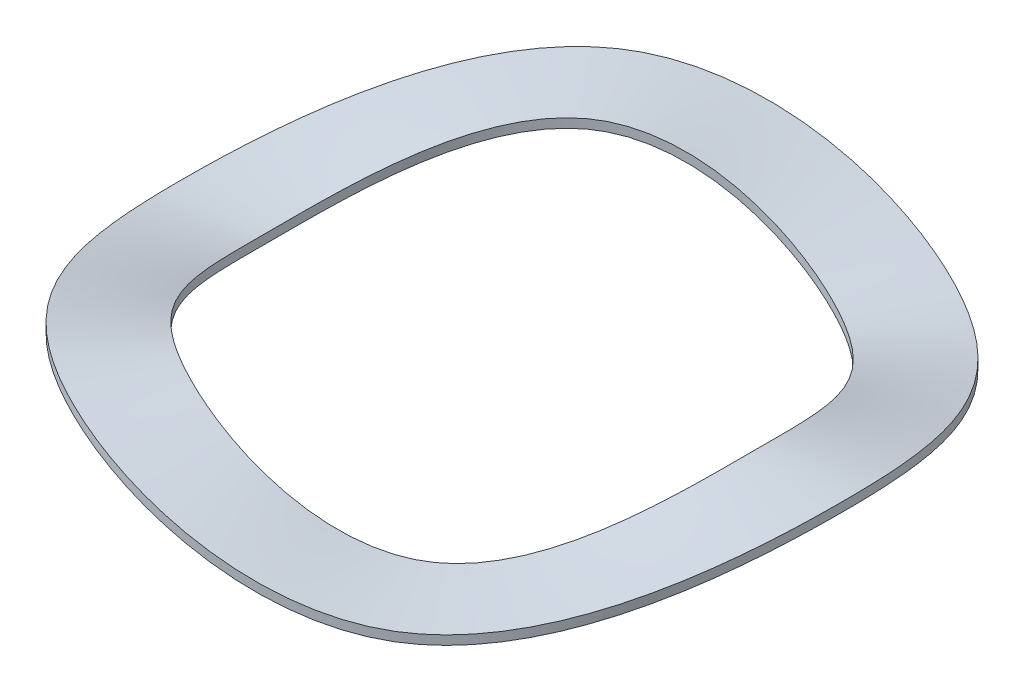
ISO-10303-21;
HEADER;
FILE_DESCRIPTION(('STEP AP214'),'2;1');
FILE_NAME('part.step','',(''),(''),'','','');
FILE_SCHEMA(('AUTOMOTIVE_DESIGN { 1 0 10303 214 1 1 1 1 }'));
ENDSEC;
DATA;
#1=APPLICATION_CONTEXT('core data for automotive mechanical design processes');
#2=APPLICATION_PROTOCOL_DEFINITION('international standard','automotive_design',2000,#1);
#3=PRODUCT_CONTEXT('',#1,'mechanical');
#4=PRODUCT('Part','Part','',(#3));
#5=PRODUCT_RELATED_PRODUCT_CATEGORY('part','',(#4));
#6=PRODUCT_DEFINITION_FORMATION('','',#4);
#7=PRODUCT_DEFINITION_CONTEXT('part definition',#1,'design');
#8=PRODUCT_DEFINITION('design','',#6,#7);
#9=PRODUCT_DEFINITION_SHAPE('','',#8);
#10=(LENGTH_UNIT() NAMED_UNIT(*) SI_UNIT(.MILLI.,.METRE.));
#11=(NAMED_UNIT(*) PLANE_ANGLE_UNIT() SI_UNIT($,.RADIAN.));
#12=(NAMED_UNIT(*) SI_UNIT($,.STERADIAN.) SOLID_ANGLE_UNIT());
#13=UNCERTAINTY_MEASURE_WITH_UNIT(LENGTH_MEASURE(1.E-05),#10,'distance_accuracy_value','');
#14=(GEOMETRIC_REPRESENTATION_CONTEXT(3) GLOBAL_UNCERTAINTY_ASSIGNED_CONTEXT((#13)) GLOBAL_UNIT_ASSIGNED_CONTEXT((#10,
#11,#12)) REPRESENTATION_CONTEXT('',''));
#15=CARTESIAN_POINT('',(0.,0.,0.));
#16=DIRECTION('',(0.,0.,1.));
#17=DIRECTION('',(1.,0.,0.));
#18=AXIS2_PLACEMENT_3D('',#15,#16,#17);
#19=CARTESIAN_POINT('',(-5.5499,0.1524,0.));
#20=CARTESIAN_POINT('',(-5.54989999999635,0.152400000000402,-0.096127087767811));
#21=CARTESIAN_POINT('',(-5.54435009998969,0.156718000001133,-0.28838126330368));
#22=CARTESIAN_POINT('',(-5.51979179248156,0.174853600002023,-0.576041573449913));
#23=CARTESIAN_POINT('',(-5.47941626997514,0.20335240000272,-0.862259977280256));
#24=CARTESIAN_POINT('',(-5.1447572999461,0.428752000005845,-2.5665932434171));
#25=CARTESIAN_POINT('',(-2.88594800003815,1.70687999999541,-5.76762526616717));
#26=CARTESIAN_POINT('',(3.3299400000528,-0.711199999995901,-5.76762526615841));
#27=CARTESIAN_POINT('',(6.6598799999156,1.87960000002413,1.21759732559044E-10));
#28=CARTESIAN_POINT('',(3.3299400004387,-0.711199999980904,5.76762526596535));
#29=CARTESIAN_POINT('',(-2.88594800037881,1.70687999998361,5.76762526596342));
#30=CARTESIAN_POINT('',(-5.14475730012056,0.428751999996578,2.56659324346797));
#31=CARTESIAN_POINT('',(-5.47941627004028,0.203352399995618,0.862259977274331));
#32=CARTESIAN_POINT('',(-5.51979179252526,0.174853599997228,0.576041573447317));
#33=CARTESIAN_POINT('',(-5.54435010001163,0.156717999998718,0.288381263303185));
#34=CARTESIAN_POINT('',(-5.54990000000366,0.152399999999597,0.0961270877678108));
#35=CARTESIAN_POINT('',(-5.5499,0.1524,0.));
#36=CARTESIAN_POINT('',(-5.0546,0.1524,0.));
#37=CARTESIAN_POINT('',(-5.05459999999667,0.152400000000403,-0.087548240118052));
#38=CARTESIAN_POINT('',(-5.04954539999061,0.156718000001134,-0.262644720354381));
#39=CARTESIAN_POINT('',(-5.02717879498321,0.174853600002023,-0.524632828908616));
#40=CARTESIAN_POINT('',(-4.99040657997736,0.20335240000272,-0.785307713861652));
#41=CARTESIAN_POINT('',(-4.68561419995091,0.428752000005846,-2.33753801116706));
#42=CARTESIAN_POINT('',(-2.62839200003474,1.70687999999541,-5.25289440717285));
#43=CARTESIAN_POINT('',(3.03276000004809,-0.711199999995901,-5.25289440716487));
#44=CARTESIAN_POINT('',(6.06551999992313,1.87960000002413,1.10892841946857E-10));
#45=CARTESIAN_POINT('',(3.03276000039955,-0.711199999980904,5.25289440698904));
#46=CARTESIAN_POINT('',(-2.62839200034501,1.70687999998361,5.25289440698728));
#47=CARTESIAN_POINT('',(-4.6856142001098,0.428751999996578,2.33753801121339));
#48=CARTESIAN_POINT('',(-4.99040658003668,0.203352399995618,0.785307713856256));
#49=CARTESIAN_POINT('',(-5.02717879502301,0.174853599997228,0.524632828906252));
#50=CARTESIAN_POINT('',(-5.04954540001059,0.156717999998718,0.262644720353931));
#51=CARTESIAN_POINT('',(-5.05460000000333,0.152399999999597,0.087548240118052));
#52=CARTESIAN_POINT('',(-5.0546,0.1524,0.));
#53=CARTESIAN_POINT('',(-4.5593,0.1524,0.));
#54=CARTESIAN_POINT('',(-4.559299999997,0.152400000000403,-0.078969392468293));
#55=CARTESIAN_POINT('',(-4.55474069999153,0.156718000001134,-0.236908177405082));
#56=CARTESIAN_POINT('',(-4.53456579748485,0.174853600002023,-0.473224084367319));
#57=CARTESIAN_POINT('',(-4.50139688997958,0.20335240000272,-0.708355450443048));
#58=CARTESIAN_POINT('',(-4.22647109995572,0.428752000005846,-2.10848277891702));
#59=CARTESIAN_POINT('',(-2.37083600003134,1.70687999999541,-4.73816354817852));
#60=CARTESIAN_POINT('',(2.73558000004338,-0.711199999995901,-4.73816354817133));
#61=CARTESIAN_POINT('',(5.47115999993066,1.87960000002413,1.00026635737292E-10));
#62=CARTESIAN_POINT('',(2.7355800003604,-0.711199999980904,4.73816354801273));
#63=CARTESIAN_POINT('',(-2.3708360003112,1.70687999998361,4.73816354801114));
#64=CARTESIAN_POINT('',(-4.22647110009904,0.428751999996578,2.10848277895881));
#65=CARTESIAN_POINT('',(-4.50139689003309,0.203352399995618,0.708355450438181));
#66=CARTESIAN_POINT('',(-4.53456579752075,0.174853599997228,0.473224084365187));
#67=CARTESIAN_POINT('',(-4.55474070000955,0.156717999998718,0.236908177404676));
#68=CARTESIAN_POINT('',(-4.559300000003,0.152399999999597,0.0789693924682933));
#69=CARTESIAN_POINT('',(-4.5593,0.1524,0.));
#70=CARTESIAN_POINT('',(-4.064,0.1524,0.));
#71=CARTESIAN_POINT('',(-4.06399999999732,0.152400000000403,-0.0703905448185346));
#72=CARTESIAN_POINT('',(-4.05993599999245,0.156718000001134,-0.211171634455784));
#73=CARTESIAN_POINT('',(-4.0419527999865,0.174853600002023,-0.421815339826023));
#74=CARTESIAN_POINT('',(-4.0123871999818,0.20335240000272,-0.631403187024444));
#75=CARTESIAN_POINT('',(-3.76732799996053,0.428752000005846,-1.87942754666698));
#76=CARTESIAN_POINT('',(-2.11328000002793,1.70687999999541,-4.2234326891842));
#77=CARTESIAN_POINT('',(2.43840000003866,-0.711199999995901,-4.22343268917778));
#78=CARTESIAN_POINT('',(4.8767999999382,1.87960000002413,8.91604464683862E-11));
#79=CARTESIAN_POINT('',(2.43840000032124,-0.711199999980904,4.22343268903641));
#80=CARTESIAN_POINT('',(-2.11328000027739,1.70687999998361,4.223432689035));
#81=CARTESIAN_POINT('',(-3.76732800008828,0.428751999996578,1.87942754670423));
#82=CARTESIAN_POINT('',(-4.01238720002949,0.203352399995618,0.631403187020105));
#83=CARTESIAN_POINT('',(-4.0419528000185,0.174853599997228,0.421815339824122));
#84=CARTESIAN_POINT('',(-4.05993600000851,0.156717999998718,0.211171634455421));
#85=CARTESIAN_POINT('',(-4.06400000000268,0.152399999999597,0.0703905448185339));
#86=CARTESIAN_POINT('',(-4.064,0.1524,0.));
#87=B_SPLINE_SURFACE_WITH_KNOTS('',3,3,((#19,#20,#21,#22,#23,#24,#25,#26,#27,#28,#29,#30,#31,
#32,#33,#34,#35),(#36,#37,#38,#39,#40,#41,#42,#43,#44,#45,#46,#47,#48,#49,#50,#51,#52),(#53,#54,
#55,#56,#57,#58,#59,#60,#61,#62,#63,#64,#65,#66,#67,#68,#69),(#70,#71,#72,#73,#74,#75,#76,#77,
#78,#79,#80,#81,#82,#83,#84,#85,#86)),.UNSPECIFIED.,.F.,.T.,.F.,(4,4),(4,1,1,1,1,1,1,1,1,1,1,1,
1,1,4),(0.,1.),(0.,0.0083333333333333,0.0166666666666666,0.0250000000000001,0.0333333333333334,
0.166666666666668,0.33333333333335,0.500000000000564,0.666666666674567,0.833333333325995,
0.966666666666667,0.975,0.983333333333333,0.991666666666667,1.),.UNSPECIFIED.);
#88=CARTESIAN_POINT('',(-5.5499,0.1524,0.));
#89=CARTESIAN_POINT('',(-5.54989999999635,0.152400000000402,-0.096127087767811));
#90=CARTESIAN_POINT('',(-5.54435009998969,0.156718000001133,-0.28838126330368));
#91=CARTESIAN_POINT('',(-5.51979179248156,0.174853600002023,-0.576041573449913));
#92=CARTESIAN_POINT('',(-5.47941626997514,0.20335240000272,-0.862259977280256));
#93=CARTESIAN_POINT('',(-5.1447572999461,0.428752000005845,-2.5665932434171));
#94=CARTESIAN_POINT('',(-2.88594800003815,1.70687999999541,-5.76762526616717));
#95=CARTESIAN_POINT('',(3.3299400000528,-0.711199999995901,-5.76762526615841));
#96=CARTESIAN_POINT('',(6.6598799999156,1.87960000002413,1.21759732559044E-10));
#97=CARTESIAN_POINT('',(3.3299400004387,-0.711199999980904,5.76762526596535));
#98=CARTESIAN_POINT('',(-2.88594800037881,1.70687999998361,5.76762526596342));
#99=CARTESIAN_POINT('',(-5.14475730012056,0.428751999996578,2.56659324346797));
#100=CARTESIAN_POINT('',(-5.47941627004028,0.203352399995618,0.862259977274331));
#101=CARTESIAN_POINT('',(-5.51979179252526,0.174853599997228,0.576041573447317));
#102=CARTESIAN_POINT('',(-5.54435010001163,0.156717999998718,0.288381263303185));
#103=CARTESIAN_POINT('',(-5.54990000000366,0.152399999999597,0.0961270877678108));
#104=CARTESIAN_POINT('',(-5.5499,0.1524,0.));
#105=B_SPLINE_CURVE_WITH_KNOTS('',3,(#88,#89,#90,#91,#92,#93,#94,#95,#96,#97,#98,#99,#100,#101,
#102,#103,#104),.UNSPECIFIED.,.T.,.F.,(4,1,1,1,1,1,1,1,1,1,1,1,1,1,4),(0.,0.0083333333333333,
0.0166666666666666,0.0250000000000001,0.0333333333333334,0.166666666666668,0.33333333333335,
0.500000000000564,0.666666666674567,0.833333333325995,0.966666666666667,0.975,0.983333333333333,
0.991666666666667,1.),.UNSPECIFIED.);
#106=CARTESIAN_POINT('',(-5.5499,0.1524,0.));
#107=VERTEX_POINT('',#106);
#108=EDGE_CURVE('E11',#107,#107,#105,.F.);
#109=CARTESIAN_POINT('',(-4.064,0.1524,0.));
#110=CARTESIAN_POINT('',(-4.06399999999732,0.152400000000403,-0.0703905448185346));
#111=CARTESIAN_POINT('',(-4.05993599999245,0.156718000001134,-0.211171634455784));
#112=CARTESIAN_POINT('',(-4.0419527999865,0.174853600002023,-0.421815339826023));
#113=CARTESIAN_POINT('',(-4.0123871999818,0.20335240000272,-0.631403187024444));
#114=CARTESIAN_POINT('',(-3.76732799996053,0.428752000005846,-1.87942754666698));
#115=CARTESIAN_POINT('',(-2.11328000002793,1.70687999999541,-4.2234326891842));
#116=CARTESIAN_POINT('',(2.43840000003866,-0.711199999995901,-4.22343268917778));
#117=CARTESIAN_POINT('',(4.8767999999382,1.87960000002413,8.91604464683862E-11));
#118=CARTESIAN_POINT('',(2.43840000032124,-0.711199999980904,4.22343268903641));
#119=CARTESIAN_POINT('',(-2.11328000027739,1.70687999998361,4.223432689035));
#120=CARTESIAN_POINT('',(-3.76732800008828,0.428751999996578,1.87942754670423));
#121=CARTESIAN_POINT('',(-4.01238720002949,0.203352399995618,0.631403187020105));
#122=CARTESIAN_POINT('',(-4.0419528000185,0.174853599997228,0.421815339824122));
#123=CARTESIAN_POINT('',(-4.05993600000851,0.156717999998718,0.211171634455421));
#124=CARTESIAN_POINT('',(-4.06400000000268,0.152399999999597,0.0703905448185339));
#125=CARTESIAN_POINT('',(-4.064,0.1524,0.));
#126=B_SPLINE_CURVE_WITH_KNOTS('',3,(#109,#110,#111,#112,#113,#114,#115,#116,#117,#118,#119,
#120,#121,#122,#123,#124,#125),.UNSPECIFIED.,.T.,.F.,(4,1,1,1,1,1,1,1,1,1,1,1,1,1,4),(0.,
0.0083333333333333,0.0166666666666666,0.0250000000000001,0.0333333333333334,0.166666666666668,
0.33333333333335,0.500000000000564,0.666666666674567,0.833333333325995,0.966666666666667,0.975,
0.983333333333333,0.991666666666667,1.),.UNSPECIFIED.);
#127=CARTESIAN_POINT('',(-4.064,0.1524,0.));
#128=VERTEX_POINT('',#127);
#129=EDGE_CURVE('E58',#128,#128,#126,.T.);
#130=ORIENTED_EDGE('',*,*,#108,.T.);
#131=EDGE_LOOP('',(#130));
#132=FACE_BOUND('',#131,.T.);
#133=ORIENTED_EDGE('',*,*,#129,.T.);
#134=EDGE_LOOP('',(#133));
#135=FACE_BOUND('',#134,.T.);
#136=ADVANCED_FACE('F46',(#132,#135),#87,.T.);
#137=CARTESIAN_POINT('',(-5.5499,0.,0.));
#138=CARTESIAN_POINT('',(-5.54989999999634,4.02563207852684E-13,-0.0961270877678112));
#139=CARTESIAN_POINT('',(-5.54435009998969,0.00431800000113352,-0.28838126330368));
#140=CARTESIAN_POINT('',(-5.51979179248156,0.0224536000020228,-0.576041573449913));
#141=CARTESIAN_POINT('',(-5.47941626997514,0.0509524000027201,-0.862259977280257));
#142=CARTESIAN_POINT('',(-5.1447572999461,0.276352000005845,-2.5665932434171));
#143=CARTESIAN_POINT('',(-2.88594800003814,1.55447999999541,-5.76762526616717));
#144=CARTESIAN_POINT('',(3.3299400000528,-0.863599999995901,-5.76762526615841));
#145=CARTESIAN_POINT('',(6.6598799999156,1.72720000002413,1.21759386969601E-10));
#146=CARTESIAN_POINT('',(3.3299400004387,-0.863599999980904,5.76762526596535));
#147=CARTESIAN_POINT('',(-2.88594800037881,1.55447999998361,5.76762526596342));
#148=CARTESIAN_POINT('',(-5.14475730012055,0.276351999996578,2.56659324346797));
#149=CARTESIAN_POINT('',(-5.47941627004028,0.0509523999956179,0.862259977274331));
#150=CARTESIAN_POINT('',(-5.51979179252526,0.0224535999972278,0.576041573447317));
#151=CARTESIAN_POINT('',(-5.54435010001162,0.00431799999871799,0.288381263303185));
#152=CARTESIAN_POINT('',(-5.54990000000365,-4.02614876862466E-13,0.0961270877678106));
#153=CARTESIAN_POINT('',(-5.5499,0.,0.));
#154=CARTESIAN_POINT('',(-5.5499,0.0126999999999999,0.));
#155=CARTESIAN_POINT('',(-5.54989999999634,0.0127000000004025,-0.0961270877678112));
#156=CARTESIAN_POINT('',(-5.54435009998969,0.0170180000011334,-0.28838126330368));
#157=CARTESIAN_POINT('',(-5.51979179248156,0.0351536000020226,-0.576041573449913));
#158=CARTESIAN_POINT('',(-5.47941626997514,0.06365240000272,-0.862259977280257));
#159=CARTESIAN_POINT('',(-5.1447572999461,0.289052000005845,-2.5665932434171));
#160=CARTESIAN_POINT('',(-2.88594800003814,1.56717999999541,-5.76762526616717));
#161=CARTESIAN_POINT('',(3.3299400000528,-0.850899999995901,-5.76762526615841));
#162=CARTESIAN_POINT('',(6.6598799999156,1.73990000002413,1.21759386969601E-10));
#163=CARTESIAN_POINT('',(3.3299400004387,-0.850899999980903,5.76762526596535));
#164=CARTESIAN_POINT('',(-2.88594800037881,1.56717999998361,5.76762526596342));
#165=CARTESIAN_POINT('',(-5.14475730012055,0.289051999996578,2.56659324346797));
#166=CARTESIAN_POINT('',(-5.47941627004028,0.0636523999956179,0.862259977274331));
#167=CARTESIAN_POINT('',(-5.51979179252526,0.0351535999972277,0.576041573447317));
#168=CARTESIAN_POINT('',(-5.54435010001162,0.0170179999987179,0.288381263303185));
#169=CARTESIAN_POINT('',(-5.54990000000365,0.0126999999995973,0.0961270877678106));
#170=CARTESIAN_POINT('',(-5.5499,0.0126999999999999,0.));
#171=CARTESIAN_POINT('',(-5.5499,0.0381,0.));
#172=CARTESIAN_POINT('',(-5.54989999999635,0.0381000000004026,-0.0961270877678109));
#173=CARTESIAN_POINT('',(-5.5443500999897,0.0424180000011335,-0.28838126330368));
#174=CARTESIAN_POINT('',(-5.51979179248156,0.0605536000020228,-0.576041573449912));
#175=CARTESIAN_POINT('',(-5.47941626997514,0.0890524000027201,-0.862259977280256));
#176=CARTESIAN_POINT('',(-5.1447572999461,0.314452000005845,-2.5665932434171));
#177=CARTESIAN_POINT('',(-2.88594800003814,1.59257999999541,-5.76762526616716));
#178=CARTESIAN_POINT('',(3.3299400000528,-0.825499999995901,-5.76762526615842));
#179=CARTESIAN_POINT('',(6.6598799999156,1.76530000002413,1.21764482719812E-10));
#180=CARTESIAN_POINT('',(3.3299400004387,-0.825499999980904,5.76762526596534));
#181=CARTESIAN_POINT('',(-2.88594800037881,1.59257999998361,5.76762526596343));
#182=CARTESIAN_POINT('',(-5.14475730012056,0.314451999996578,2.56659324346797));
#183=CARTESIAN_POINT('',(-5.47941627004028,0.0890523999956179,0.862259977274331));
#184=CARTESIAN_POINT('',(-5.51979179252526,0.0605535999972278,0.576041573447317));
#185=CARTESIAN_POINT('',(-5.54435010001163,0.042417999998718,0.288381263303185));
#186=CARTESIAN_POINT('',(-5.54990000000366,0.0380999999995974,0.0961270877678109));
#187=CARTESIAN_POINT('',(-5.5499,0.0381,0.));
#188=CARTESIAN_POINT('',(-5.54990000000001,0.0761999999999999,0.));
#189=CARTESIAN_POINT('',(-5.54989999999635,0.0762000000004025,-0.0961270877678113));
#190=CARTESIAN_POINT('',(-5.5443500999897,0.0805180000011335,-0.288381263303681));
#191=CARTESIAN_POINT('',(-5.51979179248157,0.0986536000020227,-0.576041573449914));
#192=CARTESIAN_POINT('',(-5.47941626997515,0.12715240000272,-0.862259977280258));
#193=CARTESIAN_POINT('',(-5.1447572999461,0.352552000005845,-2.56659324341711));
#194=CARTESIAN_POINT('',(-2.88594800003815,1.63067999999541,-5.76762526616719));
#195=CARTESIAN_POINT('',(3.32994000005281,-0.787399999995902,-5.7676252661584));
#196=CARTESIAN_POINT('',(6.65987999991561,1.80340000002413,1.21750875982547E-10));
#197=CARTESIAN_POINT('',(3.3299400004387,-0.787399999980904,5.76762526596537));
#198=CARTESIAN_POINT('',(-2.88594800037882,1.63067999998361,5.76762526596341));
#199=CARTESIAN_POINT('',(-5.14475730012056,0.352551999996579,2.56659324346797));
#200=CARTESIAN_POINT('',(-5.47941627004029,0.127152399995618,0.862259977274331));
#201=CARTESIAN_POINT('',(-5.51979179252527,0.0986535999972277,0.576041573447317));
#202=CARTESIAN_POINT('',(-5.54435010001163,0.0805179999987179,0.288381263303185));
#203=CARTESIAN_POINT('',(-5.54990000000366,0.0761999999995974,0.0961270877678107));
#204=CARTESIAN_POINT('',(-5.54990000000001,0.0761999999999999,0.));
#205=CARTESIAN_POINT('',(-5.5499,0.1143,0.));
#206=CARTESIAN_POINT('',(-5.54989999999634,0.114300000000403,-0.096127087767811));
#207=CARTESIAN_POINT('',(-5.54435009998969,0.118618000001133,-0.28838126330368));
#208=CARTESIAN_POINT('',(-5.51979179248156,0.136753600002023,-0.576041573449912));
#209=CARTESIAN_POINT('',(-5.47941626997514,0.16525240000272,-0.862259977280255));
#210=CARTESIAN_POINT('',(-5.1447572999461,0.390652000005845,-2.5665932434171));
#211=CARTESIAN_POINT('',(-2.88594800003815,1.66877999999541,-5.76762526616715));
#212=CARTESIAN_POINT('',(3.3299400000528,-0.749299999995901,-5.76762526615842));
#213=CARTESIAN_POINT('',(6.65987999991559,1.84150000002413,1.21766258100869E-10));
#214=CARTESIAN_POINT('',(3.3299400004387,-0.749299999980903,5.76762526596533));
#215=CARTESIAN_POINT('',(-2.88594800037881,1.66877999998361,5.76762526596343));
#216=CARTESIAN_POINT('',(-5.14475730012055,0.390651999996578,2.56659324346797));
#217=CARTESIAN_POINT('',(-5.47941627004027,0.165252399995618,0.862259977274331));
#218=CARTESIAN_POINT('',(-5.51979179252525,0.136753599997228,0.576041573447317));
#219=CARTESIAN_POINT('',(-5.54435010001162,0.118617999998718,0.288381263303185));
#220=CARTESIAN_POINT('',(-5.54990000000365,0.114299999999597,0.0961270877678106));
#221=CARTESIAN_POINT('',(-5.5499,0.1143,0.));
#222=CARTESIAN_POINT('',(-5.5499,0.1397,0.));
#223=CARTESIAN_POINT('',(-5.54989999999634,0.139700000000403,-0.0961270877678112));
#224=CARTESIAN_POINT('',(-5.54435009998969,0.144018000001133,-0.28838126330368));
#225=CARTESIAN_POINT('',(-5.51979179248156,0.162153600002023,-0.576041573449913));
#226=CARTESIAN_POINT('',(-5.47941626997514,0.19065240000272,-0.862259977280257));
#227=CARTESIAN_POINT('',(-5.1447572999461,0.416052000005845,-2.5665932434171));
#228=CARTESIAN_POINT('',(-2.88594800003814,1.69417999999541,-5.76762526616717));
#229=CARTESIAN_POINT('',(3.3299400000528,-0.723899999995901,-5.76762526615841));
#230=CARTESIAN_POINT('',(6.6598799999156,1.86690000002413,1.21759386969601E-10));
#231=CARTESIAN_POINT('',(3.3299400004387,-0.723899999980903,5.76762526596535));
#232=CARTESIAN_POINT('',(-2.88594800037881,1.69417999998361,5.76762526596342));
#233=CARTESIAN_POINT('',(-5.14475730012055,0.416051999996578,2.56659324346797));
#234=CARTESIAN_POINT('',(-5.47941627004028,0.190652399995618,0.862259977274331));
#235=CARTESIAN_POINT('',(-5.51979179252526,0.162153599997228,0.576041573447317));
#236=CARTESIAN_POINT('',(-5.54435010001162,0.144017999998718,0.288381263303185));
#237=CARTESIAN_POINT('',(-5.54990000000365,0.139699999999597,0.0961270877678106));
#238=CARTESIAN_POINT('',(-5.5499,0.1397,0.));
#239=CARTESIAN_POINT('',(-5.5499,0.1524,0.));
#240=CARTESIAN_POINT('',(-5.54989999999634,0.152400000000403,-0.0961270877678112));
#241=CARTESIAN_POINT('',(-5.54435009998969,0.156718000001134,-0.28838126330368));
#242=CARTESIAN_POINT('',(-5.51979179248156,0.174853600002023,-0.576041573449913));
#243=CARTESIAN_POINT('',(-5.47941626997514,0.20335240000272,-0.862259977280257));
#244=CARTESIAN_POINT('',(-5.1447572999461,0.428752000005845,-2.5665932434171));
#245=CARTESIAN_POINT('',(-2.88594800003814,1.70687999999541,-5.76762526616717));
#246=CARTESIAN_POINT('',(3.3299400000528,-0.711199999995901,-5.76762526615841));
#247=CARTESIAN_POINT('',(6.6598799999156,1.87960000002413,1.21759386969601E-10));
#248=CARTESIAN_POINT('',(3.3299400004387,-0.711199999980903,5.76762526596535));
#249=CARTESIAN_POINT('',(-2.88594800037881,1.70687999998361,5.76762526596342));
#250=CARTESIAN_POINT('',(-5.14475730012055,0.428751999996578,2.56659324346797));
#251=CARTESIAN_POINT('',(-5.47941627004028,0.203352399995618,0.862259977274331));
#252=CARTESIAN_POINT('',(-5.51979179252526,0.174853599997228,0.576041573447317));
#253=CARTESIAN_POINT('',(-5.54435010001162,0.156717999998718,0.288381263303185));
#254=CARTESIAN_POINT('',(-5.54990000000365,0.152399999999597,0.0961270877678106));
#255=CARTESIAN_POINT('',(-5.5499,0.1524,0.));
#256=B_SPLINE_SURFACE_WITH_KNOTS('',3,3,((#137,#138,#139,#140,#141,#142,#143,#144,#145,#146,
#147,#148,#149,#150,#151,#152,#153),(#154,#155,#156,#157,#158,#159,#160,#161,#162,#163,#164,
#165,#166,#167,#168,#169,#170),(#171,#172,#173,#174,#175,#176,#177,#178,#179,#180,#181,#182,
#183,#184,#185,#186,#187),(#188,#189,#190,#191,#192,#193,#194,#195,#196,#197,#198,#199,#200,
#201,#202,#203,#204),(#205,#206,#207,#208,#209,#210,#211,#212,#213,#214,#215,#216,#217,#218,
#219,#220,#221),(#222,#223,#224,#225,#226,#227,#228,#229,#230,#231,#232,#233,#234,#235,#236,
#237,#238),(#239,#240,#241,#242,#243,#244,#245,#246,#247,#248,#249,#250,#251,#252,#253,#254,
#255)),.UNSPECIFIED.,.F.,.T.,.F.,(4,1,1,1,4),(4,1,1,1,1,1,1,1,1,1,1,1,1,1,4),(0.914893617021276,
0.936170212765957,0.957446808510638,0.978723404255319,1.),(0.,0.0083333333333333,
0.0166666666666666,0.0250000000000001,0.0333333333333334,0.166666666666668,0.33333333333335,
0.500000000000564,0.666666666674567,0.833333333325995,0.966666666666667,0.975,0.983333333333333,
0.991666666666667,1.),.UNSPECIFIED.);
#257=CARTESIAN_POINT('',(-5.5499,0.,0.));
#258=CARTESIAN_POINT('',(-5.54989999999634,4.02563207852684E-13,-0.0961270877678112));
#259=CARTESIAN_POINT('',(-5.54435009998969,0.00431800000113352,-0.28838126330368));
#260=CARTESIAN_POINT('',(-5.51979179248156,0.0224536000020228,-0.576041573449913));
#261=CARTESIAN_POINT('',(-5.47941626997514,0.0509524000027201,-0.862259977280257));
#262=CARTESIAN_POINT('',(-5.1447572999461,0.276352000005845,-2.5665932434171));
#263=CARTESIAN_POINT('',(-2.88594800003814,1.55447999999541,-5.76762526616717));
#264=CARTESIAN_POINT('',(3.3299400000528,-0.863599999995901,-5.76762526615841));
#265=CARTESIAN_POINT('',(6.6598799999156,1.72720000002413,1.21759386969601E-10));
#266=CARTESIAN_POINT('',(3.3299400004387,-0.863599999980904,5.76762526596535));
#267=CARTESIAN_POINT('',(-2.88594800037881,1.55447999998361,5.76762526596342));
#268=CARTESIAN_POINT('',(-5.14475730012055,0.276351999996578,2.56659324346797));
#269=CARTESIAN_POINT('',(-5.47941627004028,0.0509523999956179,0.862259977274331));
#270=CARTESIAN_POINT('',(-5.51979179252526,0.0224535999972278,0.576041573447317));
#271=CARTESIAN_POINT('',(-5.54435010001162,0.00431799999871799,0.288381263303185));
#272=CARTESIAN_POINT('',(-5.54990000000365,-4.02614876862466E-13,0.0961270877678106));
#273=CARTESIAN_POINT('',(-5.5499,0.,0.));
#274=B_SPLINE_CURVE_WITH_KNOTS('',3,(#257,#258,#259,#260,#261,#262,#263,#264,#265,#266,#267,
#268,#269,#270,#271,#272,#273),.UNSPECIFIED.,.T.,.F.,(4,1,1,1,1,1,1,1,1,1,1,1,1,1,4),(0.,
0.0083333333333333,0.0166666666666666,0.0250000000000001,0.0333333333333334,0.166666666666668,
0.33333333333335,0.500000000000564,0.666666666674567,0.833333333325995,0.966666666666667,0.975,
0.983333333333333,0.991666666666667,1.),.UNSPECIFIED.);
#275=CARTESIAN_POINT('',(-5.5499,0.,0.));
#276=VERTEX_POINT('',#275);
#277=EDGE_CURVE('E52',#276,#276,#274,.T.);
#278=ORIENTED_EDGE('',*,*,#108,.F.);
#279=EDGE_LOOP('',(#278));
#280=FACE_BOUND('',#279,.T.);
#281=ORIENTED_EDGE('',*,*,#277,.F.);
#282=EDGE_LOOP('',(#281));
#283=FACE_BOUND('',#282,.T.);
#284=ADVANCED_FACE('F48',(#280,#283),#256,.T.);
#285=CARTESIAN_POINT('',(-4.064,0.,0.));
#286=CARTESIAN_POINT('',(-4.06399999999732,4.02617417961308E-13,-0.0703905448185346));
#287=CARTESIAN_POINT('',(-4.05993599999245,0.00431800000113357,-0.211171634455784));
#288=CARTESIAN_POINT('',(-4.0419527999865,0.0224536000020228,-0.421815339826023));
#289=CARTESIAN_POINT('',(-4.0123871999818,0.0509524000027202,-0.631403187024444));
#290=CARTESIAN_POINT('',(-3.76732799996053,0.276352000005845,-1.87942754666698));
#291=CARTESIAN_POINT('',(-2.11328000002793,1.55447999999541,-4.2234326891842));
#292=CARTESIAN_POINT('',(2.43840000003866,-0.863599999995901,-4.22343268917778));
#293=CARTESIAN_POINT('',(4.8767999999382,1.72720000002413,8.91604464683862E-11));
#294=CARTESIAN_POINT('',(2.43840000032124,-0.863599999980904,4.22343268903641));
#295=CARTESIAN_POINT('',(-2.11328000027739,1.55447999998361,4.223432689035));
#296=CARTESIAN_POINT('',(-3.76732800008828,0.276351999996579,1.87942754670423));
#297=CARTESIAN_POINT('',(-4.01238720002949,0.050952399995618,0.631403187020105));
#298=CARTESIAN_POINT('',(-4.0419528000185,0.0224535999972278,0.421815339824122));
#299=CARTESIAN_POINT('',(-4.05993600000851,0.00431799999871806,0.211171634455421));
#300=CARTESIAN_POINT('',(-4.06400000000268,-4.02554102248501E-13,0.0703905448185339));
#301=CARTESIAN_POINT('',(-4.064,0.,0.));
#302=CARTESIAN_POINT('',(-4.187825,0.,0.));
#303=CARTESIAN_POINT('',(-4.18782499999724,4.02617417961308E-13,-0.0725352567309742));
#304=CARTESIAN_POINT('',(-4.18363717499222,0.00431800000113357,-0.217605770193109));
#305=CARTESIAN_POINT('',(-4.16510604936109,0.0224536000020228,-0.434667525961347));
#306=CARTESIAN_POINT('',(-4.13463962248124,0.0509524000027202,-0.650641252879095));
#307=CARTESIAN_POINT('',(-3.88211377495933,0.276352000005845,-1.93669135472949));
#308=CARTESIAN_POINT('',(-2.17766900002878,1.55447999999541,-4.35211540393278));
#309=CARTESIAN_POINT('',(2.51269500003984,-0.863599999995901,-4.35211540392617));
#310=CARTESIAN_POINT('',(5.02538999993631,1.72720000002413,9.18766812304551E-11));
#311=CARTESIAN_POINT('',(2.51269500033103,-0.863599999980904,4.35211540378049));
#312=CARTESIAN_POINT('',(-2.17766900028584,1.55447999998361,4.35211540377903));
#313=CARTESIAN_POINT('',(-3.88211377509097,0.276351999996579,1.93669135476788));
#314=CARTESIAN_POINT('',(-4.1346396225304,0.050952399995618,0.650641252874624));
#315=CARTESIAN_POINT('',(-4.16510604939406,0.0224535999972278,0.434667525959388));
#316=CARTESIAN_POINT('',(-4.18363717500877,0.00431799999871806,0.217605770192735));
#317=CARTESIAN_POINT('',(-4.18782500000276,-4.02554102248501E-13,0.0725352567309738));
#318=CARTESIAN_POINT('',(-4.187825,0.,0.));
#319=CARTESIAN_POINT('',(-4.435475,0.,0.));
#320=CARTESIAN_POINT('',(-4.43547499999708,4.02452246536593E-13,-0.0768246805558539));
#321=CARTESIAN_POINT('',(-4.43103952499177,0.00431800000113341,-0.230474041667759));
#322=CARTESIAN_POINT('',(-4.41141254811027,0.0224536000020227,-0.460371898231996));
#323=CARTESIAN_POINT('',(-4.37914446748014,0.0509524000027201,-0.689117384588398));
#324=CARTESIAN_POINT('',(-4.11168532495692,0.276352000005846,-2.05121897085452));
#325=CARTESIAN_POINT('',(-2.30644700003048,1.55447999999541,-4.60948083342995));
#326=CARTESIAN_POINT('',(2.6612850000422,-0.863599999995903,-4.60948083342294));
#327=CARTESIAN_POINT('',(5.32256999993255,1.72720000002414,9.73088187176778E-11));
#328=CARTESIAN_POINT('',(2.6612850003506,-0.863599999980905,4.60948083326865));
#329=CARTESIAN_POINT('',(-2.30644700030274,1.55447999998361,4.60948083326711));
#330=CARTESIAN_POINT('',(-4.11168532509635,0.276351999996579,2.05121897089517));
#331=CARTESIAN_POINT('',(-4.3791444675322,0.0509523999956179,0.689117384583662));
#332=CARTESIAN_POINT('',(-4.41141254814519,0.0224535999972277,0.460371898229921));
#333=CARTESIAN_POINT('',(-4.43103952500929,0.0043179999987179,0.230474041667363));
#334=CARTESIAN_POINT('',(-4.43547500000293,-4.02717579607321E-13,0.0768246805558531));
#335=CARTESIAN_POINT('',(-4.435475,0.,0.));
#336=CARTESIAN_POINT('',(-4.80695,0.,0.));
#337=CARTESIAN_POINT('',(-4.80694999999683,4.02617417961308E-13,-0.0832588162931727));
#338=CARTESIAN_POINT('',(-4.80214304999107,0.00431800000113356,-0.249776448879732));
#339=CARTESIAN_POINT('',(-4.78087229623402,0.0224536000020227,-0.498928456637968));
#340=CARTESIAN_POINT('',(-4.74590173497846,0.05095240000272,-0.74683158215235));
#341=CARTESIAN_POINT('',(-4.45604264995331,0.276352000005845,-2.22301039504204));
#342=CARTESIAN_POINT('',(-2.49961400003304,1.55447999999541,-4.99552897767568));
#343=CARTESIAN_POINT('',(2.88417000004574,-0.8635999999959,-4.9955289776681));
#344=CARTESIAN_POINT('',(5.76833999992689,1.72720000002413,1.05461978397187E-10));
#345=CARTESIAN_POINT('',(2.88417000037998,-0.863599999980902,4.99552897750088));
#346=CARTESIAN_POINT('',(-2.49961400032811,1.55447999998361,4.99552897749921));
#347=CARTESIAN_POINT('',(-4.45604265010441,0.276351999996578,2.2230103950861));
#348=CARTESIAN_POINT('',(-4.74590173503488,0.0509523999956179,0.746831582147218));
#349=CARTESIAN_POINT('',(-4.78087229627187,0.0224535999972278,0.498928456635719));
#350=CARTESIAN_POINT('',(-4.80214305001006,0.00431799999871805,0.249776448879303));
#351=CARTESIAN_POINT('',(-4.80695000000316,-4.02553043457317E-13,0.0832588162931724));
#352=CARTESIAN_POINT('',(-4.80695,0.,0.));
#353=CARTESIAN_POINT('',(-5.178425,0.,0.));
#354=CARTESIAN_POINT('',(-5.17842499999659,4.02563207852684E-13,-0.0896929520304919));
#355=CARTESIAN_POINT('',(-5.17324657499039,0.00431800000113352,-0.269078856091706));
#356=CARTESIAN_POINT('',(-5.1503320443578,0.0224536000020228,-0.537485015043941));
#357=CARTESIAN_POINT('',(-5.11265900247681,0.0509524000027202,-0.804545779716304));
#358=CARTESIAN_POINT('',(-4.80039997494971,0.276352000005846,-2.39480181922957));
#359=CARTESIAN_POINT('',(-2.69278100003559,1.55447999999541,-5.38157712192143));
#360=CARTESIAN_POINT('',(3.10705500004926,-0.863599999995902,-5.38157712191326));
#361=CARTESIAN_POINT('',(6.21410999992125,1.72720000002414,1.13608714178825E-10));
#362=CARTESIAN_POINT('',(3.10705500040933,-0.863599999980905,5.38157712173312));
#363=CARTESIAN_POINT('',(-2.69278100035345,1.55447999998361,5.38157712173132));
#364=CARTESIAN_POINT('',(-4.80039997511249,0.276351999996579,2.39480181927704));
#365=CARTESIAN_POINT('',(-5.11265900253759,0.050952399995618,0.804545779710775));
#366=CARTESIAN_POINT('',(-5.15033204439857,0.0224535999972278,0.537485015041518));
#367=CARTESIAN_POINT('',(-5.17324657501085,0.00431799999871801,0.269078856091244));
#368=CARTESIAN_POINT('',(-5.17842500000341,-4.02609159390072E-13,0.0896929520304916));
#369=CARTESIAN_POINT('',(-5.178425,0.,0.));
#370=CARTESIAN_POINT('',(-5.426075,0.,0.));
#371=CARTESIAN_POINT('',(-5.42607499999643,4.02617417961308E-13,-0.0939823758553714));
#372=CARTESIAN_POINT('',(-5.42064892498992,0.00431800000113357,-0.281947127566356));
#373=CARTESIAN_POINT('',(-5.39663854310697,0.0224536000020228,-0.563189387314589));
#374=CARTESIAN_POINT('',(-5.35716384747569,0.0509524000027202,-0.843021911425605));
#375=CARTESIAN_POINT('',(-5.0299715249473,0.276352000005845,-2.50932943535459));
#376=CARTESIAN_POINT('',(-2.82155900003729,1.55447999999541,-5.63894255141859));
#377=CARTESIAN_POINT('',(3.25564500005162,-0.863599999995901,-5.63894255141003));
#378=CARTESIAN_POINT('',(6.51128999991748,1.72720000002413,1.19043880655867E-10));
#379=CARTESIAN_POINT('',(3.25564500042891,-0.863599999980904,5.63894255122127));
#380=CARTESIAN_POINT('',(-2.82155900037036,1.55447999998361,5.63894255121938));
#381=CARTESIAN_POINT('',(-5.02997152511787,0.276351999996579,2.50932943540432));
#382=CARTESIAN_POINT('',(-5.35716384753938,0.050952399995618,0.843021911419812));
#383=CARTESIAN_POINT('',(-5.3966385431497,0.0224535999972278,0.563189387312051));
#384=CARTESIAN_POINT('',(-5.42064892501137,0.00431799999871805,0.281947127565871));
#385=CARTESIAN_POINT('',(-5.42607500000357,-4.02554737523211E-13,0.0939823758553709));
#386=CARTESIAN_POINT('',(-5.426075,0.,0.));
#387=CARTESIAN_POINT('',(-5.5499,0.,0.));
#388=CARTESIAN_POINT('',(-5.54989999999634,4.02563207852684E-13,-0.0961270877678112));
#389=CARTESIAN_POINT('',(-5.54435009998969,0.00431800000113352,-0.28838126330368));
#390=CARTESIAN_POINT('',(-5.51979179248156,0.0224536000020228,-0.576041573449913));
#391=CARTESIAN_POINT('',(-5.47941626997514,0.0509524000027201,-0.862259977280257));
#392=CARTESIAN_POINT('',(-5.1447572999461,0.276352000005845,-2.5665932434171));
#393=CARTESIAN_POINT('',(-2.88594800003814,1.55447999999541,-5.76762526616717));
#394=CARTESIAN_POINT('',(3.3299400000528,-0.863599999995901,-5.76762526615841));
#395=CARTESIAN_POINT('',(6.6598799999156,1.72720000002413,1.21759386969601E-10));
#396=CARTESIAN_POINT('',(3.3299400004387,-0.863599999980904,5.76762526596535));
#397=CARTESIAN_POINT('',(-2.88594800037881,1.55447999998361,5.76762526596342));
#398=CARTESIAN_POINT('',(-5.14475730012055,0.276351999996578,2.56659324346797));
#399=CARTESIAN_POINT('',(-5.47941627004028,0.0509523999956179,0.862259977274331));
#400=CARTESIAN_POINT('',(-5.51979179252526,0.0224535999972278,0.576041573447317));
#401=CARTESIAN_POINT('',(-5.54435010001162,0.00431799999871799,0.288381263303185));
#402=CARTESIAN_POINT('',(-5.54990000000365,-4.02614876862466E-13,0.0961270877678106));
#403=CARTESIAN_POINT('',(-5.5499,0.,0.));
#404=B_SPLINE_SURFACE_WITH_KNOTS('',3,3,((#285,#286,#287,#288,#289,#290,#291,#292,#293,#294,
#295,#296,#297,#298,#299,#300,#301),(#302,#303,#304,#305,#306,#307,#308,#309,#310,#311,#312,
#313,#314,#315,#316,#317,#318),(#319,#320,#321,#322,#323,#324,#325,#326,#327,#328,#329,#330,
#331,#332,#333,#334,#335),(#336,#337,#338,#339,#340,#341,#342,#343,#344,#345,#346,#347,#348,
#349,#350,#351,#352),(#353,#354,#355,#356,#357,#358,#359,#360,#361,#362,#363,#364,#365,#366,
#367,#368,#369),(#370,#371,#372,#373,#374,#375,#376,#377,#378,#379,#380,#381,#382,#383,#384,
#385,#386),(#387,#388,#389,#390,#391,#392,#393,#394,#395,#396,#397,#398,#399,#400,#401,#402,
#403)),.UNSPECIFIED.,.F.,.T.,.F.,(4,1,1,1,4),(4,1,1,1,1,1,1,1,1,1,1,1,1,1,4),
(0.0851063829787234,0.292553191489362,0.5,0.707446808510638,0.914893617021276),(0.,
0.0083333333333333,0.0166666666666666,0.0250000000000001,0.0333333333333334,0.166666666666668,
0.33333333333335,0.500000000000564,0.666666666674567,0.833333333325995,0.966666666666667,0.975,
0.983333333333333,0.991666666666667,1.),.UNSPECIFIED.);
#405=CARTESIAN_POINT('',(-4.064,0.,0.));
#406=CARTESIAN_POINT('',(-4.06399999999732,4.02617417961308E-13,-0.0703905448185346));
#407=CARTESIAN_POINT('',(-4.05993599999245,0.00431800000113357,-0.211171634455784));
#408=CARTESIAN_POINT('',(-4.0419527999865,0.0224536000020228,-0.421815339826023));
#409=CARTESIAN_POINT('',(-4.0123871999818,0.0509524000027202,-0.631403187024444));
#410=CARTESIAN_POINT('',(-3.76732799996053,0.276352000005845,-1.87942754666698));
#411=CARTESIAN_POINT('',(-2.11328000002793,1.55447999999541,-4.2234326891842));
#412=CARTESIAN_POINT('',(2.43840000003866,-0.863599999995901,-4.22343268917778));
#413=CARTESIAN_POINT('',(4.8767999999382,1.72720000002413,8.91604464683862E-11));
#414=CARTESIAN_POINT('',(2.43840000032124,-0.863599999980904,4.22343268903641));
#415=CARTESIAN_POINT('',(-2.11328000027739,1.55447999998361,4.223432689035));
#416=CARTESIAN_POINT('',(-3.76732800008828,0.276351999996579,1.87942754670423));
#417=CARTESIAN_POINT('',(-4.01238720002949,0.050952399995618,0.631403187020105));
#418=CARTESIAN_POINT('',(-4.0419528000185,0.0224535999972278,0.421815339824122));
#419=CARTESIAN_POINT('',(-4.05993600000851,0.00431799999871806,0.211171634455421));
#420=CARTESIAN_POINT('',(-4.06400000000268,-4.02554102248501E-13,0.0703905448185339));
#421=CARTESIAN_POINT('',(-4.064,0.,0.));
#422=B_SPLINE_CURVE_WITH_KNOTS('',3,(#405,#406,#407,#408,#409,#410,#411,#412,#413,#414,#415,
#416,#417,#418,#419,#420,#421),.UNSPECIFIED.,.T.,.F.,(4,1,1,1,1,1,1,1,1,1,1,1,1,1,4),(0.,
0.0083333333333333,0.0166666666666666,0.0250000000000001,0.0333333333333334,0.166666666666668,
0.33333333333335,0.500000000000564,0.666666666674567,0.833333333325995,0.966666666666667,0.975,
0.983333333333333,0.991666666666667,1.),.UNSPECIFIED.);
#423=CARTESIAN_POINT('',(-4.064,0.,0.));
#424=VERTEX_POINT('',#423);
#425=EDGE_CURVE('E71',#424,#424,#422,.T.);
#426=ORIENTED_EDGE('',*,*,#277,.T.);
#427=EDGE_LOOP('',(#426));
#428=FACE_BOUND('',#427,.T.);
#429=ORIENTED_EDGE('',*,*,#425,.F.);
#430=EDGE_LOOP('',(#429));
#431=FACE_BOUND('',#430,.T.);
#432=ADVANCED_FACE('F86',(#428,#431),#404,.T.);
#433=CARTESIAN_POINT('',(-4.064,0.1524,0.));
#434=CARTESIAN_POINT('',(-4.06399999999732,0.152400000000403,-0.0703905448185346));
#435=CARTESIAN_POINT('',(-4.05993599999245,0.156718000001134,-0.211171634455784));
#436=CARTESIAN_POINT('',(-4.0419527999865,0.174853600002023,-0.421815339826023));
#437=CARTESIAN_POINT('',(-4.0123871999818,0.20335240000272,-0.631403187024444));
#438=CARTESIAN_POINT('',(-3.76732799996053,0.428752000005846,-1.87942754666698));
#439=CARTESIAN_POINT('',(-2.11328000002793,1.70687999999541,-4.2234326891842));
#440=CARTESIAN_POINT('',(2.43840000003866,-0.711199999995901,-4.22343268917778));
#441=CARTESIAN_POINT('',(4.8767999999382,1.87960000002413,8.91604464683862E-11));
#442=CARTESIAN_POINT('',(2.43840000032124,-0.711199999980904,4.22343268903641));
#443=CARTESIAN_POINT('',(-2.11328000027739,1.70687999998361,4.223432689035));
#444=CARTESIAN_POINT('',(-3.76732800008828,0.428751999996578,1.87942754670423));
#445=CARTESIAN_POINT('',(-4.01238720002949,0.203352399995618,0.631403187020105));
#446=CARTESIAN_POINT('',(-4.0419528000185,0.174853599997228,0.421815339824122));
#447=CARTESIAN_POINT('',(-4.05993600000851,0.156717999998718,0.211171634455421));
#448=CARTESIAN_POINT('',(-4.06400000000268,0.152399999999597,0.0703905448185339));
#449=CARTESIAN_POINT('',(-4.064,0.1524,0.));
#450=CARTESIAN_POINT('',(-4.064,0.1397,0.));
#451=CARTESIAN_POINT('',(-4.06399999999732,0.139700000000403,-0.0703905448185345));
#452=CARTESIAN_POINT('',(-4.05993599999245,0.144018000001134,-0.211171634455784));
#453=CARTESIAN_POINT('',(-4.0419527999865,0.162153600002023,-0.421815339826023));
#454=CARTESIAN_POINT('',(-4.0123871999818,0.19065240000272,-0.631403187024444));
#455=CARTESIAN_POINT('',(-3.76732799996053,0.416052000005845,-1.87942754666698));
#456=CARTESIAN_POINT('',(-2.11328000002793,1.69417999999541,-4.22343268918419));
#457=CARTESIAN_POINT('',(2.43840000003866,-0.723899999995901,-4.22343268917778));
#458=CARTESIAN_POINT('',(4.8767999999382,1.86690000002413,8.9160626039371E-11));
#459=CARTESIAN_POINT('',(2.43840000032124,-0.723899999980904,4.22343268903641));
#460=CARTESIAN_POINT('',(-2.11328000027739,1.69417999998361,4.223432689035));
#461=CARTESIAN_POINT('',(-3.76732800008828,0.416051999996578,1.87942754670423));
#462=CARTESIAN_POINT('',(-4.01238720002949,0.190652399995618,0.631403187020105));
#463=CARTESIAN_POINT('',(-4.0419528000185,0.162153599997228,0.421815339824122));
#464=CARTESIAN_POINT('',(-4.05993600000851,0.144017999998718,0.211171634455421));
#465=CARTESIAN_POINT('',(-4.06400000000268,0.139699999999597,0.070390544818534));
#466=CARTESIAN_POINT('',(-4.064,0.1397,0.));
#467=CARTESIAN_POINT('',(-4.064,0.1143,0.));
#468=CARTESIAN_POINT('',(-4.06399999999732,0.114300000000403,-0.0703905448185348));
#469=CARTESIAN_POINT('',(-4.05993599999245,0.118618000001133,-0.211171634455785));
#470=CARTESIAN_POINT('',(-4.0419527999865,0.136753600002023,-0.421815339826024));
#471=CARTESIAN_POINT('',(-4.0123871999818,0.16525240000272,-0.631403187024445));
#472=CARTESIAN_POINT('',(-3.76732799996053,0.390652000005846,-1.87942754666699));
#473=CARTESIAN_POINT('',(-2.11328000002793,1.66877999999541,-4.2234326891842));
#474=CARTESIAN_POINT('',(2.43840000003866,-0.749299999995902,-4.22343268917779));
#475=CARTESIAN_POINT('',(4.8767999999382,1.84150000002413,8.91599551892767E-11));
#476=CARTESIAN_POINT('',(2.43840000032125,-0.749299999980904,4.22343268903642));
#477=CARTESIAN_POINT('',(-2.11328000027739,1.66877999998361,4.223432689035));
#478=CARTESIAN_POINT('',(-3.76732800008828,0.390651999996578,1.87942754670423));
#479=CARTESIAN_POINT('',(-4.0123872000295,0.165252399995618,0.631403187020105));
#480=CARTESIAN_POINT('',(-4.0419528000185,0.136753599997228,0.421815339824123));
#481=CARTESIAN_POINT('',(-4.05993600000851,0.118617999998718,0.211171634455422));
#482=CARTESIAN_POINT('',(-4.06400000000268,0.114299999999597,0.070390544818534));
#483=CARTESIAN_POINT('',(-4.064,0.1143,0.));
#484=CARTESIAN_POINT('',(-4.064,0.0762000000000001,0.));
#485=CARTESIAN_POINT('',(-4.06399999999732,0.0762000000004027,-0.0703905448185346));
#486=CARTESIAN_POINT('',(-4.05993599999245,0.0805180000011336,-0.211171634455784));
#487=CARTESIAN_POINT('',(-4.0419527999865,0.0986536000020228,-0.421815339826023));
#488=CARTESIAN_POINT('',(-4.01238719998179,0.12715240000272,-0.631403187024444));
#489=CARTESIAN_POINT('',(-3.76732799996053,0.352552000005845,-1.87942754666698));
#490=CARTESIAN_POINT('',(-2.11328000002793,1.63067999999541,-4.22343268918419));
#491=CARTESIAN_POINT('',(2.43840000003866,-0.787399999995901,-4.22343268917778));
#492=CARTESIAN_POINT('',(4.87679999993819,1.80340000002413,8.91622387901025E-11));
#493=CARTESIAN_POINT('',(2.43840000032124,-0.787399999980904,4.22343268903641));
#494=CARTESIAN_POINT('',(-2.11328000027739,1.63067999998361,4.223432689035));
#495=CARTESIAN_POINT('',(-3.76732800008828,0.352551999996579,1.87942754670423));
#496=CARTESIAN_POINT('',(-4.01238720002949,0.127152399995618,0.631403187020104));
#497=CARTESIAN_POINT('',(-4.04195280001849,0.098653599997228,0.421815339824122));
#498=CARTESIAN_POINT('',(-4.05993600000851,0.0805179999987182,0.211171634455421));
#499=CARTESIAN_POINT('',(-4.06400000000268,0.0761999999995975,0.0703905448185339));
#500=CARTESIAN_POINT('',(-4.064,0.0762000000000001,0.));
#501=CARTESIAN_POINT('',(-4.06400000000001,0.0380999999999999,0.));
#502=CARTESIAN_POINT('',(-4.06399999999733,0.0381000000004025,-0.0703905448185347));
#503=CARTESIAN_POINT('',(-4.05993599999246,0.0424180000011335,-0.211171634455784));
#504=CARTESIAN_POINT('',(-4.0419527999865,0.0605536000020227,-0.421815339826024));
#505=CARTESIAN_POINT('',(-4.0123871999818,0.0890524000027201,-0.631403187024445));
#506=CARTESIAN_POINT('',(-3.76732799996053,0.314452000005845,-1.87942754666699));
#507=CARTESIAN_POINT('',(-2.11328000002793,1.59257999999541,-4.2234326891842));
#508=CARTESIAN_POINT('',(2.43840000003866,-0.825499999995901,-4.22343268917779));
#509=CARTESIAN_POINT('',(4.8767999999382,1.76530000002413,8.91595723303846E-11));
#510=CARTESIAN_POINT('',(2.43840000032124,-0.825499999980903,4.22343268903642));
#511=CARTESIAN_POINT('',(-2.11328000027739,1.59257999998361,4.223432689035));
#512=CARTESIAN_POINT('',(-3.76732800008828,0.314451999996578,1.87942754670423));
#513=CARTESIAN_POINT('',(-4.0123872000295,0.0890523999956178,0.631403187020105));
#514=CARTESIAN_POINT('',(-4.0419528000185,0.0605535999972277,0.421815339824122));
#515=CARTESIAN_POINT('',(-4.05993600000852,0.0424179999987179,0.211171634455422));
#516=CARTESIAN_POINT('',(-4.06400000000268,0.0380999999995973,0.0703905448185339));
#517=CARTESIAN_POINT('',(-4.06400000000001,0.0380999999999999,0.));
#518=CARTESIAN_POINT('',(-4.064,0.0127,0.));
#519=CARTESIAN_POINT('',(-4.06399999999732,0.0127000000004025,-0.0703905448185346));
#520=CARTESIAN_POINT('',(-4.05993599999245,0.0170180000011335,-0.211171634455784));
#521=CARTESIAN_POINT('',(-4.0419527999865,0.0351536000020227,-0.421815339826023));
#522=CARTESIAN_POINT('',(-4.0123871999818,0.0636524000027201,-0.631403187024444));
#523=CARTESIAN_POINT('',(-3.76732799996053,0.289052000005845,-1.87942754666698));
#524=CARTESIAN_POINT('',(-2.11328000002793,1.56717999999541,-4.2234326891842));
#525=CARTESIAN_POINT('',(2.43840000003866,-0.850899999995901,-4.22343268917778));
#526=CARTESIAN_POINT('',(4.8767999999382,1.73990000002413,8.91604464683862E-11));
#527=CARTESIAN_POINT('',(2.43840000032124,-0.850899999980904,4.22343268903641));
#528=CARTESIAN_POINT('',(-2.11328000027739,1.56717999998361,4.223432689035));
#529=CARTESIAN_POINT('',(-3.76732800008828,0.289051999996578,1.87942754670423));
#530=CARTESIAN_POINT('',(-4.01238720002949,0.0636523999956179,0.631403187020105));
#531=CARTESIAN_POINT('',(-4.0419528000185,0.0351535999972278,0.421815339824122));
#532=CARTESIAN_POINT('',(-4.05993600000851,0.017017999998718,0.211171634455421));
#533=CARTESIAN_POINT('',(-4.06400000000268,0.0126999999995974,0.0703905448185339));
#534=CARTESIAN_POINT('',(-4.064,0.0127,0.));
#535=CARTESIAN_POINT('',(-4.064,0.,0.));
#536=CARTESIAN_POINT('',(-4.06399999999732,4.02617417961308E-13,-0.0703905448185346));
#537=CARTESIAN_POINT('',(-4.05993599999245,0.00431800000113357,-0.211171634455784));
#538=CARTESIAN_POINT('',(-4.0419527999865,0.0224536000020228,-0.421815339826023));
#539=CARTESIAN_POINT('',(-4.0123871999818,0.0509524000027202,-0.631403187024444));
#540=CARTESIAN_POINT('',(-3.76732799996053,0.276352000005845,-1.87942754666698));
#541=CARTESIAN_POINT('',(-2.11328000002793,1.55447999999541,-4.2234326891842));
#542=CARTESIAN_POINT('',(2.43840000003866,-0.863599999995901,-4.22343268917778));
#543=CARTESIAN_POINT('',(4.8767999999382,1.72720000002413,8.91604464683862E-11));
#544=CARTESIAN_POINT('',(2.43840000032124,-0.863599999980904,4.22343268903641));
#545=CARTESIAN_POINT('',(-2.11328000027739,1.55447999998361,4.223432689035));
#546=CARTESIAN_POINT('',(-3.76732800008828,0.276351999996579,1.87942754670423));
#547=CARTESIAN_POINT('',(-4.01238720002949,0.050952399995618,0.631403187020105));
#548=CARTESIAN_POINT('',(-4.0419528000185,0.0224535999972278,0.421815339824122));
#549=CARTESIAN_POINT('',(-4.05993600000851,0.00431799999871806,0.211171634455421));
#550=CARTESIAN_POINT('',(-4.06400000000268,-4.02554102248501E-13,0.0703905448185339));
#551=CARTESIAN_POINT('',(-4.064,0.,0.));
#552=B_SPLINE_SURFACE_WITH_KNOTS('',3,3,((#433,#434,#435,#436,#437,#438,#439,#440,#441,#442,
#443,#444,#445,#446,#447,#448,#449),(#450,#451,#452,#453,#454,#455,#456,#457,#458,#459,#460,
#461,#462,#463,#464,#465,#466),(#467,#468,#469,#470,#471,#472,#473,#474,#475,#476,#477,#478,
#479,#480,#481,#482,#483),(#484,#485,#486,#487,#488,#489,#490,#491,#492,#493,#494,#495,#496,
#497,#498,#499,#500),(#501,#502,#503,#504,#505,#506,#507,#508,#509,#510,#511,#512,#513,#514,
#515,#516,#517),(#518,#519,#520,#521,#522,#523,#524,#525,#526,#527,#528,#529,#530,#531,#532,
#533,#534),(#535,#536,#537,#538,#539,#540,#541,#542,#543,#544,#545,#546,#547,#548,#549,#550,
#551)),.UNSPECIFIED.,.F.,.T.,.F.,(4,1,1,1,4),(4,1,1,1,1,1,1,1,1,1,1,1,1,1,4),(0.,
0.0212765957446809,0.0425531914893617,0.0638297872340426,0.0851063829787234),(0.,
0.0083333333333333,0.0166666666666666,0.0250000000000001,0.0333333333333334,0.166666666666668,
0.33333333333335,0.500000000000564,0.666666666674567,0.833333333325995,0.966666666666667,0.975,
0.983333333333333,0.991666666666667,1.),.UNSPECIFIED.);
#553=ORIENTED_EDGE('',*,*,#425,.T.);
#554=EDGE_LOOP('',(#553));
#555=FACE_BOUND('',#554,.T.);
#556=ORIENTED_EDGE('',*,*,#129,.F.);
#557=EDGE_LOOP('',(#556));
#558=FACE_BOUND('',#557,.T.);
#559=ADVANCED_FACE('F95',(#555,#558),#552,.T.);
#560=CLOSED_SHELL('',(#136,#284,#432,#559));
#561=MANIFOLD_SOLID_BREP('B2',#560);
#562=ADVANCED_BREP_SHAPE_REPRESENTATION('',(#18,#561),#14);
#563=SHAPE_DEFINITION_REPRESENTATION(#9,#562);
ENDSEC;
END-ISO-10303-21;
